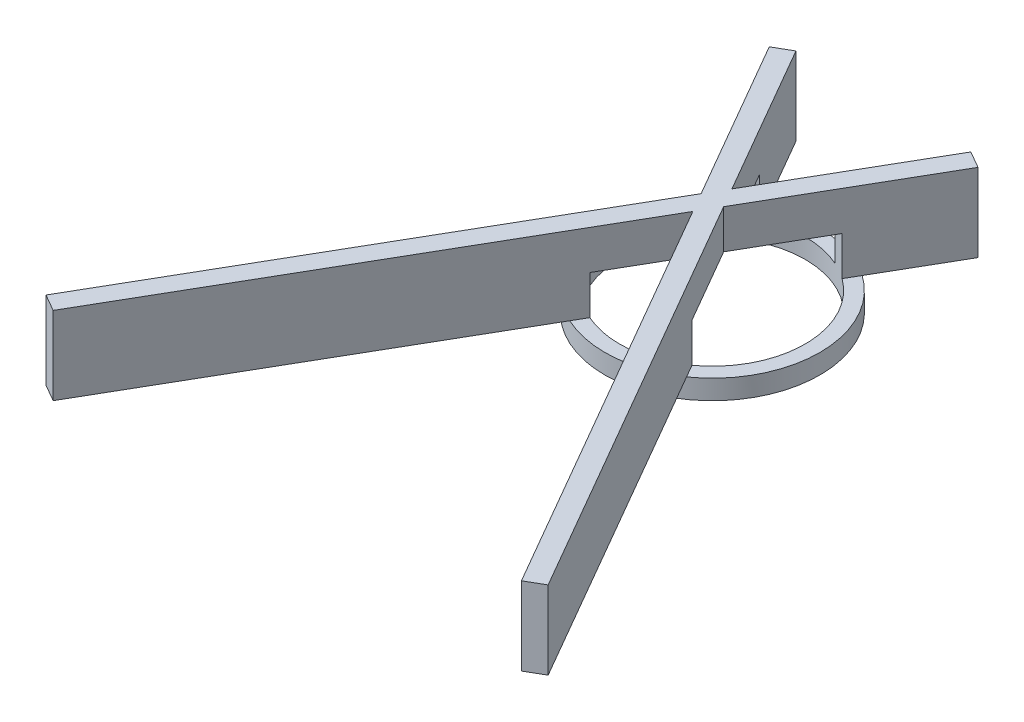
ISO-10303-21;
HEADER;
FILE_DESCRIPTION(('STEP AP214'),'2;1');
FILE_NAME('part.step','',(''),(''),'','','');
FILE_SCHEMA(('AUTOMOTIVE_DESIGN { 1 0 10303 214 1 1 1 1 }'));
ENDSEC;
DATA;
#1=APPLICATION_CONTEXT('core data for automotive mechanical design processes');
#2=APPLICATION_PROTOCOL_DEFINITION('international standard','automotive_design',2000,#1);
#3=PRODUCT_CONTEXT('',#1,'mechanical');
#4=PRODUCT('Part','Part','',(#3));
#5=PRODUCT_RELATED_PRODUCT_CATEGORY('part','',(#4));
#6=PRODUCT_DEFINITION_FORMATION('','',#4);
#7=PRODUCT_DEFINITION_CONTEXT('part definition',#1,'design');
#8=PRODUCT_DEFINITION('design','',#6,#7);
#9=PRODUCT_DEFINITION_SHAPE('','',#8);
#10=(LENGTH_UNIT() NAMED_UNIT(*) SI_UNIT(.MILLI.,.METRE.));
#11=(NAMED_UNIT(*) PLANE_ANGLE_UNIT() SI_UNIT($,.RADIAN.));
#12=(NAMED_UNIT(*) SI_UNIT($,.STERADIAN.) SOLID_ANGLE_UNIT());
#13=UNCERTAINTY_MEASURE_WITH_UNIT(LENGTH_MEASURE(1.E-05),#10,'distance_accuracy_value','');
#14=(GEOMETRIC_REPRESENTATION_CONTEXT(3) GLOBAL_UNCERTAINTY_ASSIGNED_CONTEXT((#13)) GLOBAL_UNIT_ASSIGNED_CONTEXT((#10,
#11,#12)) REPRESENTATION_CONTEXT('',''));
#15=CARTESIAN_POINT('',(0.,0.,0.));
#16=DIRECTION('',(0.,0.,1.));
#17=DIRECTION('',(1.,0.,0.));
#18=AXIS2_PLACEMENT_3D('',#15,#16,#17);
#19=CARTESIAN_POINT('',(0.,2.,0.));
#20=DIRECTION('',(0.,1.,0.));
#21=DIRECTION('',(0.,0.,1.));
#22=AXIS2_PLACEMENT_3D('',#19,#20,#21);
#23=PLANE('',#22);
#24=DIRECTION('',(0.499999999999998,0.,-0.86602540378444));
#25=VECTOR('',#24,1.);
#26=CARTESIAN_POINT('',(-23.9600361713693,2.,43.5));
#27=LINE('',#26,#25);
#28=CARTESIAN_POINT('',(5.58963631070722,2.,-7.68153408597683));
#29=VERTEX_POINT('',#28);
#30=CARTESIAN_POINT('',(6.34325097883609,2.,-8.9868329805052));
#31=VERTEX_POINT('',#30);
#32=EDGE_CURVE('E367',#29,#31,#27,.T.);
#33=ORIENTED_EDGE('',*,*,#32,.F.);
#34=CARTESIAN_POINT('',(0.,2.,0.));
#35=DIRECTION('',(0.,1.,0.));
#36=DIRECTION('',(0.,0.,1.));
#37=AXIS2_PLACEMENT_3D('',#34,#35,#36);
#38=CIRCLE('',#37,9.50000000000003);
#39=CARTESIAN_POINT('',(5.58963631070724,2.,7.68153408597682));
#40=VERTEX_POINT('',#39);
#41=EDGE_CURVE('E358',#40,#29,#38,.T.);
#42=ORIENTED_EDGE('',*,*,#41,.F.);
#43=DIRECTION('',(0.499999999999998,0.,0.86602540378444));
#44=VECTOR('',#43,1.);
#45=CARTESIAN_POINT('',(-8.94892917243913,2.,-17.5));
#46=LINE('',#45,#44);
#47=CARTESIAN_POINT('',(6.3432509788361,2.,8.98683298050517));
#48=VERTEX_POINT('',#47);
#49=EDGE_CURVE('E372',#40,#48,#46,.T.);
#50=ORIENTED_EDGE('',*,*,#49,.T.);
#51=CARTESIAN_POINT('',(0.,2.,0.));
#52=DIRECTION('',(0.,1.,0.));
#53=DIRECTION('',(0.,0.,1.));
#54=AXIS2_PLACEMENT_3D('',#51,#52,#53);
#55=CIRCLE('',#54,11.);
#56=EDGE_CURVE('E366',#48,#31,#55,.T.);
#57=ORIENTED_EDGE('',*,*,#56,.T.);
#58=EDGE_LOOP('',(#33,#42,#50,#57));
#59=FACE_BOUND('',#58,.T.);
#60=ADVANCED_FACE('F59',(#59),#23,.T.);
#61=CARTESIAN_POINT('',(-6.34325097883608,2.,-8.98683298050518));
#62=VERTEX_POINT('',#61);
#63=CARTESIAN_POINT('',(-6.34325097883609,2.,8.98683298050517));
#64=VERTEX_POINT('',#63);
#65=EDGE_CURVE('E429',#62,#64,#55,.T.);
#66=ORIENTED_EDGE('',*,*,#65,.T.);
#67=DIRECTION('',(0.499999999999998,0.,-0.86602540378444));
#68=VECTOR('',#67,1.);
#69=CARTESIAN_POINT('',(-25.6920869789382,2.,42.5));
#70=LINE('',#69,#68);
#71=CARTESIAN_POINT('',(-5.58963631070723,2.,7.68153408597682));
#72=VERTEX_POINT('',#71);
#73=EDGE_CURVE('E378',#64,#72,#70,.T.);
#74=ORIENTED_EDGE('',*,*,#73,.T.);
#75=CARTESIAN_POINT('',(-5.58963631070722,2.,-7.68153408597683));
#76=VERTEX_POINT('',#75);
#77=EDGE_CURVE('E360',#76,#72,#38,.T.);
#78=ORIENTED_EDGE('',*,*,#77,.F.);
#79=DIRECTION('',(0.499999999999998,0.,0.86602540378444));
#80=VECTOR('',#79,1.);
#81=CARTESIAN_POINT('',(-10.680979980008,2.,-16.5));
#82=LINE('',#81,#80);
#83=EDGE_CURVE('E285',#62,#76,#82,.T.);
#84=ORIENTED_EDGE('',*,*,#83,.F.);
#85=EDGE_LOOP('',(#66,#74,#78,#84));
#86=FACE_BOUND('',#85,.T.);
#87=ADVANCED_FACE('F482',(#86),#23,.T.);
#88=CARTESIAN_POINT('',(4.61120017126721,2.,-9.98683298050518));
#89=VERTEX_POINT('',#88);
#90=CARTESIAN_POINT('',(-4.61120017126721,2.,-9.98683298050518));
#91=VERTEX_POINT('',#90);
#92=EDGE_CURVE('E425',#89,#91,#55,.T.);
#93=ORIENTED_EDGE('',*,*,#92,.T.);
#94=CARTESIAN_POINT('',(-3.85758550313834,2.,-8.68153408597682));
#95=VERTEX_POINT('',#94);
#96=EDGE_CURVE('E293',#91,#95,#46,.T.);
#97=ORIENTED_EDGE('',*,*,#96,.T.);
#98=CARTESIAN_POINT('',(3.85758550313834,2.,-8.68153408597682));
#99=VERTEX_POINT('',#98);
#100=EDGE_CURVE('E228',#99,#95,#38,.T.);
#101=ORIENTED_EDGE('',*,*,#100,.F.);
#102=EDGE_CURVE('E342',#99,#89,#70,.T.);
#103=ORIENTED_EDGE('',*,*,#102,.T.);
#104=EDGE_LOOP('',(#93,#97,#101,#103));
#105=FACE_BOUND('',#104,.T.);
#106=ADVANCED_FACE('F461',(#105),#23,.T.);
#107=CARTESIAN_POINT('',(0.,0.,0.));
#108=DIRECTION('',(0.,1.,0.));
#109=DIRECTION('',(0.,0.,1.));
#110=AXIS2_PLACEMENT_3D('',#107,#108,#109);
#111=CYLINDRICAL_SURFACE('',#110,11.);
#112=CARTESIAN_POINT('',(0.,0.,0.));
#113=DIRECTION('',(0.,1.,0.));
#114=DIRECTION('',(0.,0.,1.));
#115=AXIS2_PLACEMENT_3D('',#112,#113,#114);
#116=CIRCLE('',#115,11.);
#117=CARTESIAN_POINT('',(0.,0.,11.));
#118=VERTEX_POINT('',#117);
#119=EDGE_CURVE('E361',#118,#118,#116,.T.);
#120=ORIENTED_EDGE('',*,*,#119,.T.);
#121=EDGE_LOOP('',(#120));
#122=FACE_BOUND('',#121,.T.);
#123=CARTESIAN_POINT('',(4.61120017126722,2.,9.98683298050517));
#124=VERTEX_POINT('',#123);
#125=EDGE_CURVE('E364',#124,#48,#55,.T.);
#126=ORIENTED_EDGE('',*,*,#125,.F.);
#127=CARTESIAN_POINT('',(-4.61120017126721,2.,9.98683298050517));
#128=VERTEX_POINT('',#127);
#129=EDGE_CURVE('E357',#128,#124,#55,.T.);
#130=ORIENTED_EDGE('',*,*,#129,.F.);
#131=EDGE_CURVE('E434',#64,#128,#55,.T.);
#132=ORIENTED_EDGE('',*,*,#131,.F.);
#133=ORIENTED_EDGE('',*,*,#65,.F.);
#134=EDGE_CURVE('E427',#91,#62,#55,.T.);
#135=ORIENTED_EDGE('',*,*,#134,.F.);
#136=ORIENTED_EDGE('',*,*,#92,.F.);
#137=EDGE_CURVE('E388',#31,#89,#55,.T.);
#138=ORIENTED_EDGE('',*,*,#137,.F.);
#139=ORIENTED_EDGE('',*,*,#56,.F.);
#140=EDGE_LOOP('',(#126,#130,#132,#133,#135,#136,#138,#139));
#141=FACE_BOUND('',#140,.T.);
#142=ADVANCED_FACE('F61',(#122,#141),#111,.T.);
#143=CARTESIAN_POINT('',(0.,0.,0.));
#144=DIRECTION('',(0.,1.,0.));
#145=DIRECTION('',(0.,0.,1.));
#146=AXIS2_PLACEMENT_3D('',#143,#144,#145);
#147=PLANE('',#146);
#148=CARTESIAN_POINT('',(0.,0.,0.));
#149=DIRECTION('',(0.,1.,0.));
#150=DIRECTION('',(0.,0.,1.));
#151=AXIS2_PLACEMENT_3D('',#148,#149,#150);
#152=CIRCLE('',#151,9.50000000000003);
#153=CARTESIAN_POINT('',(0.,0.,9.50000000000003));
#154=VERTEX_POINT('',#153);
#155=EDGE_CURVE('E354',#154,#154,#152,.T.);
#156=ORIENTED_EDGE('',*,*,#155,.T.);
#157=EDGE_LOOP('',(#156));
#158=FACE_BOUND('',#157,.T.);
#159=ORIENTED_EDGE('',*,*,#119,.F.);
#160=EDGE_LOOP('',(#159));
#161=FACE_BOUND('',#160,.T.);
#162=ADVANCED_FACE('F490',(#158,#161),#147,.F.);
#163=CARTESIAN_POINT('',(3.85758550313836,2.,8.68153408597682));
#164=VERTEX_POINT('',#163);
#165=EDGE_CURVE('E376',#164,#124,#82,.T.);
#166=ORIENTED_EDGE('',*,*,#165,.F.);
#167=CARTESIAN_POINT('',(-3.85758550313835,2.,8.68153408597682));
#168=VERTEX_POINT('',#167);
#169=EDGE_CURVE('E353',#168,#164,#38,.T.);
#170=ORIENTED_EDGE('',*,*,#169,.F.);
#171=EDGE_CURVE('E335',#128,#168,#27,.T.);
#172=ORIENTED_EDGE('',*,*,#171,.F.);
#173=ORIENTED_EDGE('',*,*,#129,.T.);
#174=EDGE_LOOP('',(#166,#170,#172,#173));
#175=FACE_BOUND('',#174,.T.);
#176=ADVANCED_FACE('F445',(#175),#23,.T.);
#177=CARTESIAN_POINT('',(0.,0.,0.));
#178=DIRECTION('',(0.,1.,0.));
#179=DIRECTION('',(0.,0.,1.));
#180=AXIS2_PLACEMENT_3D('',#177,#178,#179);
#181=CYLINDRICAL_SURFACE('',#180,9.50000000000003);
#182=ORIENTED_EDGE('',*,*,#155,.F.);
#183=EDGE_LOOP('',(#182));
#184=FACE_BOUND('',#183,.T.);
#185=ORIENTED_EDGE('',*,*,#169,.T.);
#186=DIRECTION('',(0.,-1.,0.));
#187=VECTOR('',#186,1.);
#188=CARTESIAN_POINT('',(3.85758550313836,36.8700576850889,8.68153408597682));
#189=LINE('',#188,#187);
#190=CARTESIAN_POINT('',(3.85758550313836,6.,8.68153408597682));
#191=VERTEX_POINT('',#190);
#192=EDGE_CURVE('E258',#191,#164,#189,.T.);
#193=ORIENTED_EDGE('',*,*,#192,.F.);
#194=CARTESIAN_POINT('',(0.,6.,0.));
#195=DIRECTION('',(0.,-1.,0.));
#196=DIRECTION('',(0.,0.,-1.));
#197=AXIS2_PLACEMENT_3D('',#194,#195,#196);
#198=CIRCLE('',#197,9.50000000000003);
#199=CARTESIAN_POINT('',(5.58963631070724,6.,7.68153408597682));
#200=VERTEX_POINT('',#199);
#201=EDGE_CURVE('E480',#191,#200,#198,.F.);
#202=ORIENTED_EDGE('',*,*,#201,.T.);
#203=DIRECTION('',(0.,-1.,0.));
#204=VECTOR('',#203,1.);
#205=CARTESIAN_POINT('',(5.58963631070724,36.8700576850889,7.68153408597682));
#206=LINE('',#205,#204);
#207=EDGE_CURVE('E13',#200,#40,#206,.T.);
#208=ORIENTED_EDGE('',*,*,#207,.T.);
#209=ORIENTED_EDGE('',*,*,#41,.T.);
#210=DIRECTION('',(0.,-1.,0.));
#211=VECTOR('',#210,1.);
#212=CARTESIAN_POINT('',(5.58963631070722,36.8700576850889,-7.68153408597683));
#213=LINE('',#212,#211);
#214=CARTESIAN_POINT('',(5.58963631070722,6.,-7.68153408597683));
#215=VERTEX_POINT('',#214);
#216=EDGE_CURVE('E232',#215,#29,#213,.T.);
#217=ORIENTED_EDGE('',*,*,#216,.F.);
#218=CARTESIAN_POINT('',(3.85758550313834,6.,-8.68153408597683));
#219=VERTEX_POINT('',#218);
#220=EDGE_CURVE('E242',#215,#219,#198,.F.);
#221=ORIENTED_EDGE('',*,*,#220,.T.);
#222=DIRECTION('',(0.,-1.,0.));
#223=VECTOR('',#222,1.);
#224=CARTESIAN_POINT('',(3.85758550313834,36.8700576850889,-8.68153408597683));
#225=LINE('',#224,#223);
#226=EDGE_CURVE('E233',#219,#99,#225,.T.);
#227=ORIENTED_EDGE('',*,*,#226,.T.);
#228=ORIENTED_EDGE('',*,*,#100,.T.);
#229=DIRECTION('',(0.,-1.,0.));
#230=VECTOR('',#229,1.);
#231=CARTESIAN_POINT('',(-3.85758550313834,36.8700576850889,-8.68153408597682));
#232=LINE('',#231,#230);
#233=CARTESIAN_POINT('',(-3.85758550313834,6.,-8.68153408597682));
#234=VERTEX_POINT('',#233);
#235=EDGE_CURVE('E221',#95,#234,#232,.F.);
#236=ORIENTED_EDGE('',*,*,#235,.T.);
#237=CARTESIAN_POINT('',(-5.58963631070722,6.,-7.68153408597683));
#238=VERTEX_POINT('',#237);
#239=EDGE_CURVE('E225',#234,#238,#198,.F.);
#240=ORIENTED_EDGE('',*,*,#239,.T.);
#241=DIRECTION('',(0.,-1.,0.));
#242=VECTOR('',#241,1.);
#243=CARTESIAN_POINT('',(-5.58963631070722,36.8700576850889,-7.68153408597683));
#244=LINE('',#243,#242);
#245=EDGE_CURVE('E260',#76,#238,#244,.F.);
#246=ORIENTED_EDGE('',*,*,#245,.F.);
#247=ORIENTED_EDGE('',*,*,#77,.T.);
#248=DIRECTION('',(0.,-1.,0.));
#249=VECTOR('',#248,1.);
#250=CARTESIAN_POINT('',(-5.58963631070723,36.8700576850889,7.68153408597682));
#251=LINE('',#250,#249);
#252=CARTESIAN_POINT('',(-5.58963631070723,6.,7.68153408597682));
#253=VERTEX_POINT('',#252);
#254=EDGE_CURVE('E264',#72,#253,#251,.F.);
#255=ORIENTED_EDGE('',*,*,#254,.T.);
#256=CARTESIAN_POINT('',(-3.85758550313835,6.,8.68153408597682));
#257=VERTEX_POINT('',#256);
#258=EDGE_CURVE('E240',#253,#257,#198,.F.);
#259=ORIENTED_EDGE('',*,*,#258,.T.);
#260=DIRECTION('',(0.,-1.,0.));
#261=VECTOR('',#260,1.);
#262=CARTESIAN_POINT('',(-3.85758550313835,36.8700576850889,8.68153408597682));
#263=LINE('',#262,#261);
#264=EDGE_CURVE('E250',#168,#257,#263,.F.);
#265=ORIENTED_EDGE('',*,*,#264,.F.);
#266=EDGE_LOOP('',(#185,#193,#202,#208,#209,#217,#221,#227,#228,#236,#240,#246,#247,#255,#259,#265));
#267=FACE_BOUND('',#266,.T.);
#268=ADVANCED_FACE('F224',(#184,#267),#181,.F.);
#269=CARTESIAN_POINT('',(0.,2.,0.));
#270=DIRECTION('',(0.,-1.,0.));
#271=DIRECTION('',(-1.,0.,0.));
#272=AXIS2_PLACEMENT_3D('',#269,#270,#271);
#273=PLANE('',#272);
#274=CARTESIAN_POINT('',(23.9600361713693,2.,43.5));
#275=VERTEX_POINT('',#274);
#276=EDGE_CURVE('E266',#124,#275,#82,.T.);
#277=ORIENTED_EDGE('',*,*,#276,.F.);
#278=ORIENTED_EDGE('',*,*,#125,.T.);
#279=CARTESIAN_POINT('',(25.6920869789382,2.,42.5));
#280=VERTEX_POINT('',#279);
#281=EDGE_CURVE('E288',#48,#280,#46,.T.);
#282=ORIENTED_EDGE('',*,*,#281,.T.);
#283=DIRECTION('',(-0.86602540378444,0.,0.499999999999998));
#284=VECTOR('',#283,1.);
#285=CARTESIAN_POINT('',(25.6920869789382,2.,42.5));
#286=LINE('',#285,#284);
#287=EDGE_CURVE('E284',#280,#275,#286,.T.);
#288=ORIENTED_EDGE('',*,*,#287,.T.);
#289=EDGE_LOOP('',(#277,#278,#282,#288));
#290=FACE_BOUND('',#289,.T.);
#291=ADVANCED_FACE('F414',(#290),#273,.T.);
#292=CARTESIAN_POINT('',(10.680979980008,2.,-16.5));
#293=VERTEX_POINT('',#292);
#294=EDGE_CURVE('E315',#31,#293,#27,.T.);
#295=ORIENTED_EDGE('',*,*,#294,.F.);
#296=ORIENTED_EDGE('',*,*,#137,.T.);
#297=CARTESIAN_POINT('',(8.94892917243914,2.,-17.5));
#298=VERTEX_POINT('',#297);
#299=EDGE_CURVE('E82',#89,#298,#70,.T.);
#300=ORIENTED_EDGE('',*,*,#299,.T.);
#301=DIRECTION('',(0.866025403784439,0.,0.5));
#302=VECTOR('',#301,1.);
#303=CARTESIAN_POINT('',(8.94892917243914,2.,-17.5));
#304=LINE('',#303,#302);
#305=EDGE_CURVE('E334',#298,#293,#304,.T.);
#306=ORIENTED_EDGE('',*,*,#305,.T.);
#307=EDGE_LOOP('',(#295,#296,#300,#306));
#308=FACE_BOUND('',#307,.T.);
#309=ADVANCED_FACE('F387',(#308),#273,.T.);
#310=CARTESIAN_POINT('',(-8.94892917243913,2.,-17.5));
#311=VERTEX_POINT('',#310);
#312=EDGE_CURVE('E289',#311,#91,#46,.T.);
#313=ORIENTED_EDGE('',*,*,#312,.T.);
#314=ORIENTED_EDGE('',*,*,#134,.T.);
#315=CARTESIAN_POINT('',(-10.680979980008,2.,-16.5));
#316=VERTEX_POINT('',#315);
#317=EDGE_CURVE('E281',#316,#62,#82,.T.);
#318=ORIENTED_EDGE('',*,*,#317,.F.);
#319=DIRECTION('',(0.86602540378444,0.,-0.499999999999998));
#320=VECTOR('',#319,1.);
#321=CARTESIAN_POINT('',(-10.680979980008,2.,-16.5));
#322=LINE('',#321,#320);
#323=EDGE_CURVE('E292',#316,#311,#322,.T.);
#324=ORIENTED_EDGE('',*,*,#323,.T.);
#325=EDGE_LOOP('',(#313,#314,#318,#324));
#326=FACE_BOUND('',#325,.T.);
#327=ADVANCED_FACE('F463',(#326),#273,.T.);
#328=CARTESIAN_POINT('',(-23.9600361713693,10.,43.5));
#329=DIRECTION('',(-0.86602540378444,0.,-0.499999999999998));
#330=DIRECTION('',(-0.499999999999998,0.,0.86602540378444));
#331=AXIS2_PLACEMENT_3D('',#328,#329,#330);
#332=PLANE('',#331);
#333=ORIENTED_EDGE('',*,*,#171,.T.);
#334=ORIENTED_EDGE('',*,*,#264,.T.);
#335=DIRECTION('',(-0.499999999999998,0.,0.86602540378444));
#336=VECTOR('',#335,1.);
#337=CARTESIAN_POINT('',(-23.9600361713693,6.,43.5));
#338=LINE('',#337,#336);
#339=CARTESIAN_POINT('',(0.,6.,2.));
#340=VERTEX_POINT('',#339);
#341=EDGE_CURVE('E471',#340,#257,#338,.T.);
#342=ORIENTED_EDGE('',*,*,#341,.F.);
#343=DIRECTION('',(0.,-1.,0.));
#344=VECTOR('',#343,1.);
#345=CARTESIAN_POINT('',(0.,10.,1.99999999999999));
#346=LINE('',#345,#344);
#347=CARTESIAN_POINT('',(0.,10.,2.00000000000001));
#348=VERTEX_POINT('',#347);
#349=EDGE_CURVE('E312',#348,#340,#346,.T.);
#350=ORIENTED_EDGE('',*,*,#349,.F.);
#351=DIRECTION('',(0.499999999999998,0.,-0.86602540378444));
#352=VECTOR('',#351,1.);
#353=CARTESIAN_POINT('',(-23.9600361713693,10.,43.5));
#354=LINE('',#353,#352);
#355=CARTESIAN_POINT('',(-23.9600361713693,10.,43.5));
#356=VERTEX_POINT('',#355);
#357=EDGE_CURVE('E316',#356,#348,#354,.T.);
#358=ORIENTED_EDGE('',*,*,#357,.F.);
#359=DIRECTION('',(0.,-1.,0.));
#360=VECTOR('',#359,1.);
#361=CARTESIAN_POINT('',(-23.9600361713693,10.,43.5));
#362=LINE('',#361,#360);
#363=CARTESIAN_POINT('',(-23.9600361713693,2.,43.5));
#364=VERTEX_POINT('',#363);
#365=EDGE_CURVE('E330',#356,#364,#362,.T.);
#366=ORIENTED_EDGE('',*,*,#365,.T.);
#367=EDGE_CURVE('E331',#364,#128,#27,.T.);
#368=ORIENTED_EDGE('',*,*,#367,.T.);
#369=EDGE_LOOP('',(#333,#334,#342,#350,#358,#366,#368));
#370=FACE_BOUND('',#369,.T.);
#371=ADVANCED_FACE('F448',(#370),#332,.F.);
#372=CARTESIAN_POINT('',(-25.6920869789382,10.,42.5));
#373=DIRECTION('',(-0.86602540378444,0.,-0.499999999999998));
#374=DIRECTION('',(-0.499999999999998,0.,0.86602540378444));
#375=AXIS2_PLACEMENT_3D('',#372,#373,#374);
#376=PLANE('',#375);
#377=ORIENTED_EDGE('',*,*,#254,.F.);
#378=ORIENTED_EDGE('',*,*,#73,.F.);
#379=CARTESIAN_POINT('',(-25.6920869789382,2.,42.5));
#380=VERTEX_POINT('',#379);
#381=EDGE_CURVE('E338',#380,#64,#70,.T.);
#382=ORIENTED_EDGE('',*,*,#381,.F.);
#383=DIRECTION('',(0.,-1.,0.));
#384=VECTOR('',#383,1.);
#385=CARTESIAN_POINT('',(-25.6920869789382,10.,42.5));
#386=LINE('',#385,#384);
#387=CARTESIAN_POINT('',(-25.6920869789382,10.,42.5));
#388=VERTEX_POINT('',#387);
#389=EDGE_CURVE('E346',#388,#380,#386,.T.);
#390=ORIENTED_EDGE('',*,*,#389,.F.);
#391=DIRECTION('',(0.499999999999998,0.,-0.86602540378444));
#392=VECTOR('',#391,1.);
#393=CARTESIAN_POINT('',(-25.6920869789382,10.,42.5));
#394=LINE('',#393,#392);
#395=CARTESIAN_POINT('',(-1.15470053837924,10.,0.));
#396=VERTEX_POINT('',#395);
#397=EDGE_CURVE('E324',#388,#396,#394,.T.);
#398=ORIENTED_EDGE('',*,*,#397,.T.);
#399=DIRECTION('',(0.,-1.,0.));
#400=VECTOR('',#399,1.);
#401=CARTESIAN_POINT('',(-1.15470053837925,10.,0.));
#402=LINE('',#401,#400);
#403=CARTESIAN_POINT('',(-1.15470053837924,6.,0.));
#404=VERTEX_POINT('',#403);
#405=EDGE_CURVE('E309',#396,#404,#402,.T.);
#406=ORIENTED_EDGE('',*,*,#405,.T.);
#407=DIRECTION('',(-0.499999999999998,0.,0.86602540378444));
#408=VECTOR('',#407,1.);
#409=CARTESIAN_POINT('',(-25.6920869789382,6.,42.5));
#410=LINE('',#409,#408);
#411=EDGE_CURVE('E248',#404,#253,#410,.T.);
#412=ORIENTED_EDGE('',*,*,#411,.T.);
#413=EDGE_LOOP('',(#377,#378,#382,#390,#398,#406,#412));
#414=FACE_BOUND('',#413,.T.);
#415=ADVANCED_FACE('F457',(#414),#376,.T.);
#416=DIRECTION('',(-0.499999999999998,0.,0.86602540378444));
#417=VECTOR('',#416,1.);
#418=CARTESIAN_POINT('',(-23.9600361713693,6.,43.5));
#419=LINE('',#418,#417);
#420=CARTESIAN_POINT('',(1.15470053837925,6.,0.));
#421=VERTEX_POINT('',#420);
#422=EDGE_CURVE('E74',#215,#421,#419,.T.);
#423=ORIENTED_EDGE('',*,*,#422,.F.);
#424=ORIENTED_EDGE('',*,*,#216,.T.);
#425=ORIENTED_EDGE('',*,*,#32,.T.);
#426=ORIENTED_EDGE('',*,*,#294,.T.);
#427=DIRECTION('',(0.,-1.,0.));
#428=VECTOR('',#427,1.);
#429=CARTESIAN_POINT('',(10.680979980008,10.,-16.5));
#430=LINE('',#429,#428);
#431=CARTESIAN_POINT('',(10.680979980008,10.,-16.5));
#432=VERTEX_POINT('',#431);
#433=EDGE_CURVE('E350',#432,#293,#430,.T.);
#434=ORIENTED_EDGE('',*,*,#433,.F.);
#435=CARTESIAN_POINT('',(1.15470053837925,10.,0.));
#436=VERTEX_POINT('',#435);
#437=EDGE_CURVE('E320',#436,#432,#354,.T.);
#438=ORIENTED_EDGE('',*,*,#437,.F.);
#439=DIRECTION('',(0.,-1.,0.));
#440=VECTOR('',#439,1.);
#441=CARTESIAN_POINT('',(1.15470053837925,10.,0.));
#442=LINE('',#441,#440);
#443=EDGE_CURVE('E306',#436,#421,#442,.T.);
#444=ORIENTED_EDGE('',*,*,#443,.T.);
#445=EDGE_LOOP('',(#423,#424,#425,#426,#434,#438,#444));
#446=FACE_BOUND('',#445,.T.);
#447=ADVANCED_FACE('F380',(#446),#332,.F.);
#448=CARTESIAN_POINT('',(8.94892917243914,10.,-17.5));
#449=DIRECTION('',(0.5,0.,-0.866025403784439));
#450=DIRECTION('',(-0.866025403784439,0.,-0.5));
#451=AXIS2_PLACEMENT_3D('',#448,#449,#450);
#452=PLANE('',#451);
#453=ORIENTED_EDGE('',*,*,#305,.F.);
#454=DIRECTION('',(0.,-1.,0.));
#455=VECTOR('',#454,1.);
#456=CARTESIAN_POINT('',(8.94892917243914,10.,-17.5));
#457=LINE('',#456,#455);
#458=CARTESIAN_POINT('',(8.94892917243914,10.,-17.5));
#459=VERTEX_POINT('',#458);
#460=EDGE_CURVE('E348',#459,#298,#457,.T.);
#461=ORIENTED_EDGE('',*,*,#460,.F.);
#462=DIRECTION('',(0.866025403784439,0.,0.5));
#463=VECTOR('',#462,1.);
#464=CARTESIAN_POINT('',(8.94892917243914,10.,-17.5));
#465=LINE('',#464,#463);
#466=EDGE_CURVE('E319',#459,#432,#465,.T.);
#467=ORIENTED_EDGE('',*,*,#466,.T.);
#468=ORIENTED_EDGE('',*,*,#433,.T.);
#469=EDGE_LOOP('',(#453,#461,#467,#468));
#470=FACE_BOUND('',#469,.T.);
#471=ADVANCED_FACE('F384',(#470),#452,.T.);
#472=ORIENTED_EDGE('',*,*,#226,.F.);
#473=DIRECTION('',(-0.499999999999998,0.,0.86602540378444));
#474=VECTOR('',#473,1.);
#475=CARTESIAN_POINT('',(-25.6920869789382,6.,42.5));
#476=LINE('',#475,#474);
#477=CARTESIAN_POINT('',(0.,6.,-2.00000000000002));
#478=VERTEX_POINT('',#477);
#479=EDGE_CURVE('E247',#219,#478,#476,.T.);
#480=ORIENTED_EDGE('',*,*,#479,.T.);
#481=DIRECTION('',(0.,-1.,0.));
#482=VECTOR('',#481,1.);
#483=CARTESIAN_POINT('',(0.,10.,-2.00000000000002));
#484=LINE('',#483,#482);
#485=CARTESIAN_POINT('',(0.,10.,-2.00000000000002));
#486=VERTEX_POINT('',#485);
#487=EDGE_CURVE('E246',#486,#478,#484,.T.);
#488=ORIENTED_EDGE('',*,*,#487,.F.);
#489=EDGE_CURVE('E323',#486,#459,#394,.T.);
#490=ORIENTED_EDGE('',*,*,#489,.T.);
#491=ORIENTED_EDGE('',*,*,#460,.T.);
#492=ORIENTED_EDGE('',*,*,#299,.F.);
#493=ORIENTED_EDGE('',*,*,#102,.F.);
#494=EDGE_LOOP('',(#472,#480,#488,#490,#491,#492,#493));
#495=FACE_BOUND('',#494,.T.);
#496=ADVANCED_FACE('F391',(#495),#376,.T.);
#497=CARTESIAN_POINT('',(-23.9600361713693,10.,43.5));
#498=DIRECTION('',(-0.5,0.,0.866025403784439));
#499=DIRECTION('',(0.866025403784439,0.,0.5));
#500=AXIS2_PLACEMENT_3D('',#497,#498,#499);
#501=PLANE('',#500);
#502=DIRECTION('',(-0.866025403784439,0.,-0.5));
#503=VECTOR('',#502,1.);
#504=CARTESIAN_POINT('',(-23.9600361713693,2.,43.5));
#505=LINE('',#504,#503);
#506=EDGE_CURVE('E341',#364,#380,#505,.T.);
#507=ORIENTED_EDGE('',*,*,#506,.F.);
#508=ORIENTED_EDGE('',*,*,#365,.F.);
#509=DIRECTION('',(-0.866025403784439,0.,-0.5));
#510=VECTOR('',#509,1.);
#511=CARTESIAN_POINT('',(-23.9600361713693,10.,43.5));
#512=LINE('',#511,#510);
#513=EDGE_CURVE('E327',#356,#388,#512,.T.);
#514=ORIENTED_EDGE('',*,*,#513,.T.);
#515=ORIENTED_EDGE('',*,*,#389,.T.);
#516=EDGE_LOOP('',(#507,#508,#514,#515));
#517=FACE_BOUND('',#516,.T.);
#518=ADVANCED_FACE('F453',(#517),#501,.T.);
#519=CARTESIAN_POINT('',(0.,10.,0.));
#520=DIRECTION('',(0.,-1.,0.));
#521=DIRECTION('',(-1.,0.,0.));
#522=AXIS2_PLACEMENT_3D('',#519,#520,#521);
#523=PLANE('',#522);
#524=ORIENTED_EDGE('',*,*,#489,.F.);
#525=DIRECTION('',(0.499999999999998,0.,0.86602540378444));
#526=VECTOR('',#525,1.);
#527=CARTESIAN_POINT('',(-8.94892917243913,10.,-17.5));
#528=LINE('',#527,#526);
#529=CARTESIAN_POINT('',(-8.94892917243913,10.,-17.5));
#530=VERTEX_POINT('',#529);
#531=EDGE_CURVE('E275',#530,#486,#528,.T.);
#532=ORIENTED_EDGE('',*,*,#531,.F.);
#533=DIRECTION('',(0.86602540378444,0.,-0.499999999999998));
#534=VECTOR('',#533,1.);
#535=CARTESIAN_POINT('',(-10.680979980008,10.,-16.5));
#536=LINE('',#535,#534);
#537=CARTESIAN_POINT('',(-10.680979980008,10.,-16.5));
#538=VERTEX_POINT('',#537);
#539=EDGE_CURVE('E277',#538,#530,#536,.T.);
#540=ORIENTED_EDGE('',*,*,#539,.F.);
#541=DIRECTION('',(0.499999999999998,0.,0.86602540378444));
#542=VECTOR('',#541,1.);
#543=CARTESIAN_POINT('',(-10.680979980008,10.,-16.5));
#544=LINE('',#543,#542);
#545=EDGE_CURVE('E267',#538,#396,#544,.T.);
#546=ORIENTED_EDGE('',*,*,#545,.T.);
#547=ORIENTED_EDGE('',*,*,#397,.F.);
#548=ORIENTED_EDGE('',*,*,#513,.F.);
#549=ORIENTED_EDGE('',*,*,#357,.T.);
#550=CARTESIAN_POINT('',(23.9600361713693,10.,43.5));
#551=VERTEX_POINT('',#550);
#552=EDGE_CURVE('E271',#348,#551,#544,.T.);
#553=ORIENTED_EDGE('',*,*,#552,.T.);
#554=DIRECTION('',(-0.86602540378444,0.,0.499999999999998));
#555=VECTOR('',#554,1.);
#556=CARTESIAN_POINT('',(25.6920869789382,10.,42.5));
#557=LINE('',#556,#555);
#558=CARTESIAN_POINT('',(25.6920869789382,10.,42.5));
#559=VERTEX_POINT('',#558);
#560=EDGE_CURVE('E270',#559,#551,#557,.T.);
#561=ORIENTED_EDGE('',*,*,#560,.F.);
#562=EDGE_CURVE('E274',#436,#559,#528,.T.);
#563=ORIENTED_EDGE('',*,*,#562,.F.);
#564=ORIENTED_EDGE('',*,*,#437,.T.);
#565=ORIENTED_EDGE('',*,*,#466,.F.);
#566=EDGE_LOOP('',(#524,#532,#540,#546,#547,#548,#549,#553,#561,#563,#564,#565));
#567=FACE_BOUND('',#566,.T.);
#568=ADVANCED_FACE('F394',(#567),#523,.F.);
#569=ORIENTED_EDGE('',*,*,#381,.T.);
#570=ORIENTED_EDGE('',*,*,#131,.T.);
#571=ORIENTED_EDGE('',*,*,#367,.F.);
#572=ORIENTED_EDGE('',*,*,#506,.T.);
#573=EDGE_LOOP('',(#569,#570,#571,#572));
#574=FACE_BOUND('',#573,.T.);
#575=ADVANCED_FACE('F451',(#574),#273,.T.);
#576=CARTESIAN_POINT('',(-10.680979980008,10.,-16.5));
#577=DIRECTION('',(-0.499999999999997,0.,-0.86602540378444));
#578=DIRECTION('',(-0.86602540378444,0.,0.499999999999997));
#579=AXIS2_PLACEMENT_3D('',#576,#577,#578);
#580=PLANE('',#579);
#581=ORIENTED_EDGE('',*,*,#323,.F.);
#582=DIRECTION('',(0.,-1.,0.));
#583=VECTOR('',#582,1.);
#584=CARTESIAN_POINT('',(-10.680979980008,10.,-16.5));
#585=LINE('',#584,#583);
#586=EDGE_CURVE('E280',#538,#316,#585,.T.);
#587=ORIENTED_EDGE('',*,*,#586,.F.);
#588=ORIENTED_EDGE('',*,*,#539,.T.);
#589=DIRECTION('',(0.,-1.,0.));
#590=VECTOR('',#589,1.);
#591=CARTESIAN_POINT('',(-8.94892917243913,10.,-17.5));
#592=LINE('',#591,#590);
#593=EDGE_CURVE('E297',#530,#311,#592,.T.);
#594=ORIENTED_EDGE('',*,*,#593,.T.);
#595=EDGE_LOOP('',(#581,#587,#588,#594));
#596=FACE_BOUND('',#595,.T.);
#597=ADVANCED_FACE('F466',(#596),#580,.T.);
#598=CARTESIAN_POINT('',(-8.94892917243913,10.,-17.5));
#599=DIRECTION('',(0.86602540378444,0.,-0.499999999999998));
#600=DIRECTION('',(-0.499999999999998,0.,-0.86602540378444));
#601=AXIS2_PLACEMENT_3D('',#598,#599,#600);
#602=PLANE('',#601);
#603=ORIENTED_EDGE('',*,*,#235,.F.);
#604=ORIENTED_EDGE('',*,*,#96,.F.);
#605=ORIENTED_EDGE('',*,*,#312,.F.);
#606=ORIENTED_EDGE('',*,*,#593,.F.);
#607=ORIENTED_EDGE('',*,*,#531,.T.);
#608=ORIENTED_EDGE('',*,*,#487,.T.);
#609=DIRECTION('',(-0.499999999999998,0.,-0.86602540378444));
#610=VECTOR('',#609,1.);
#611=CARTESIAN_POINT('',(-8.94892917243913,6.,-17.5));
#612=LINE('',#611,#610);
#613=EDGE_CURVE('E236',#478,#234,#612,.T.);
#614=ORIENTED_EDGE('',*,*,#613,.T.);
#615=EDGE_LOOP('',(#603,#604,#605,#606,#607,#608,#614));
#616=FACE_BOUND('',#615,.T.);
#617=ADVANCED_FACE('F244',(#616),#602,.T.);
#618=CARTESIAN_POINT('',(-10.680979980008,10.,-16.5));
#619=DIRECTION('',(0.86602540378444,0.,-0.499999999999998));
#620=DIRECTION('',(-0.499999999999998,0.,-0.86602540378444));
#621=AXIS2_PLACEMENT_3D('',#618,#619,#620);
#622=PLANE('',#621);
#623=ORIENTED_EDGE('',*,*,#83,.T.);
#624=ORIENTED_EDGE('',*,*,#245,.T.);
#625=DIRECTION('',(-0.499999999999998,0.,-0.86602540378444));
#626=VECTOR('',#625,1.);
#627=CARTESIAN_POINT('',(-10.680979980008,6.,-16.5));
#628=LINE('',#627,#626);
#629=EDGE_CURVE('E239',#404,#238,#628,.T.);
#630=ORIENTED_EDGE('',*,*,#629,.F.);
#631=ORIENTED_EDGE('',*,*,#405,.F.);
#632=ORIENTED_EDGE('',*,*,#545,.F.);
#633=ORIENTED_EDGE('',*,*,#586,.T.);
#634=ORIENTED_EDGE('',*,*,#317,.T.);
#635=EDGE_LOOP('',(#623,#624,#630,#631,#632,#633,#634));
#636=FACE_BOUND('',#635,.T.);
#637=ADVANCED_FACE('F470',(#636),#622,.F.);
#638=DIRECTION('',(-0.499999999999998,0.,-0.86602540378444));
#639=VECTOR('',#638,1.);
#640=CARTESIAN_POINT('',(-10.680979980008,6.,-16.5));
#641=LINE('',#640,#639);
#642=EDGE_CURVE('E472',#191,#340,#641,.T.);
#643=ORIENTED_EDGE('',*,*,#642,.F.);
#644=ORIENTED_EDGE('',*,*,#192,.T.);
#645=ORIENTED_EDGE('',*,*,#165,.T.);
#646=ORIENTED_EDGE('',*,*,#276,.T.);
#647=DIRECTION('',(0.,-1.,0.));
#648=VECTOR('',#647,1.);
#649=CARTESIAN_POINT('',(23.9600361713693,10.,43.5));
#650=LINE('',#649,#648);
#651=EDGE_CURVE('E302',#551,#275,#650,.T.);
#652=ORIENTED_EDGE('',*,*,#651,.F.);
#653=ORIENTED_EDGE('',*,*,#552,.F.);
#654=ORIENTED_EDGE('',*,*,#349,.T.);
#655=EDGE_LOOP('',(#643,#644,#645,#646,#652,#653,#654));
#656=FACE_BOUND('',#655,.T.);
#657=ADVANCED_FACE('F410',(#656),#622,.F.);
#658=ORIENTED_EDGE('',*,*,#207,.F.);
#659=DIRECTION('',(-0.499999999999998,0.,-0.86602540378444));
#660=VECTOR('',#659,1.);
#661=CARTESIAN_POINT('',(-8.94892917243913,6.,-17.5));
#662=LINE('',#661,#660);
#663=EDGE_CURVE('E67',#200,#421,#662,.T.);
#664=ORIENTED_EDGE('',*,*,#663,.T.);
#665=ORIENTED_EDGE('',*,*,#443,.F.);
#666=ORIENTED_EDGE('',*,*,#562,.T.);
#667=DIRECTION('',(0.,-1.,0.));
#668=VECTOR('',#667,1.);
#669=CARTESIAN_POINT('',(25.6920869789382,10.,42.5));
#670=LINE('',#669,#668);
#671=EDGE_CURVE('E299',#559,#280,#670,.T.);
#672=ORIENTED_EDGE('',*,*,#671,.T.);
#673=ORIENTED_EDGE('',*,*,#281,.F.);
#674=ORIENTED_EDGE('',*,*,#49,.F.);
#675=EDGE_LOOP('',(#658,#664,#665,#666,#672,#673,#674));
#676=FACE_BOUND('',#675,.T.);
#677=ADVANCED_FACE('F398',(#676),#602,.T.);
#678=CARTESIAN_POINT('',(25.6920869789382,10.,42.5));
#679=DIRECTION('',(0.499999999999997,0.,0.86602540378444));
#680=DIRECTION('',(0.86602540378444,0.,-0.499999999999997));
#681=AXIS2_PLACEMENT_3D('',#678,#679,#680);
#682=PLANE('',#681);
#683=ORIENTED_EDGE('',*,*,#287,.F.);
#684=ORIENTED_EDGE('',*,*,#671,.F.);
#685=ORIENTED_EDGE('',*,*,#560,.T.);
#686=ORIENTED_EDGE('',*,*,#651,.T.);
#687=EDGE_LOOP('',(#683,#684,#685,#686));
#688=FACE_BOUND('',#687,.T.);
#689=ADVANCED_FACE('F403',(#688),#682,.T.);
#690=CARTESIAN_POINT('',(0.,6.,0.));
#691=DIRECTION('',(0.,-1.,0.));
#692=DIRECTION('',(-1.,0.,0.));
#693=AXIS2_PLACEMENT_3D('',#690,#691,#692);
#694=PLANE('',#693);
#695=ORIENTED_EDGE('',*,*,#220,.F.);
#696=ORIENTED_EDGE('',*,*,#422,.T.);
#697=ORIENTED_EDGE('',*,*,#663,.F.);
#698=ORIENTED_EDGE('',*,*,#201,.F.);
#699=ORIENTED_EDGE('',*,*,#642,.T.);
#700=ORIENTED_EDGE('',*,*,#341,.T.);
#701=ORIENTED_EDGE('',*,*,#258,.F.);
#702=ORIENTED_EDGE('',*,*,#411,.F.);
#703=ORIENTED_EDGE('',*,*,#629,.T.);
#704=ORIENTED_EDGE('',*,*,#239,.F.);
#705=ORIENTED_EDGE('',*,*,#613,.F.);
#706=ORIENTED_EDGE('',*,*,#479,.F.);
#707=EDGE_LOOP('',(#695,#696,#697,#698,#699,#700,#701,#702,#703,#704,#705,#706));
#708=FACE_BOUND('',#707,.T.);
#709=ADVANCED_FACE('F235',(#708),#694,.T.);
#710=CLOSED_SHELL('',(#60,#87,#106,#142,#162,#176,#268,#291,#309,#327,#371,#415,#447,#471,#496,
#518,#568,#575,#597,#617,#637,#657,#677,#689,#709));
#711=MANIFOLD_SOLID_BREP('B2',#710);
#712=ADVANCED_BREP_SHAPE_REPRESENTATION('',(#18,#711),#14);
#713=SHAPE_DEFINITION_REPRESENTATION(#9,#712);
ENDSEC;
END-ISO-10303-21;
